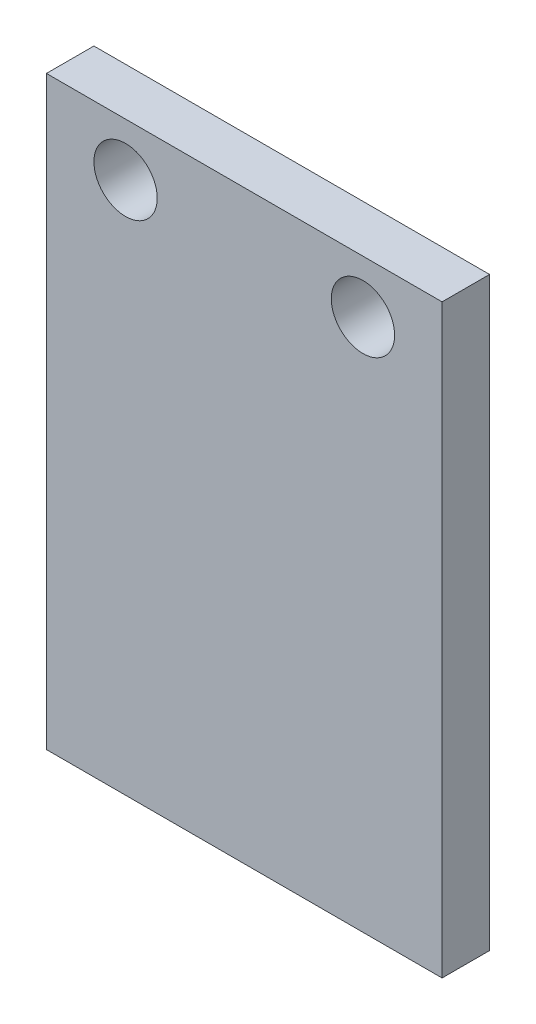
ISO-10303-21;
HEADER;
FILE_DESCRIPTION(('STEP AP214'),'2;1');
FILE_NAME('part.step','',(''),(''),'','','');
FILE_SCHEMA(('AUTOMOTIVE_DESIGN { 1 0 10303 214 1 1 1 1 }'));
ENDSEC;
DATA;
#1=APPLICATION_CONTEXT('core data for automotive mechanical design processes');
#2=APPLICATION_PROTOCOL_DEFINITION('international standard','automotive_design',2000,#1);
#3=PRODUCT_CONTEXT('',#1,'mechanical');
#4=PRODUCT('Part','Part','',(#3));
#5=PRODUCT_RELATED_PRODUCT_CATEGORY('part','',(#4));
#6=PRODUCT_DEFINITION_FORMATION('','',#4);
#7=PRODUCT_DEFINITION_CONTEXT('part definition',#1,'design');
#8=PRODUCT_DEFINITION('design','',#6,#7);
#9=PRODUCT_DEFINITION_SHAPE('','',#8);
#10=(LENGTH_UNIT() NAMED_UNIT(*) SI_UNIT(.MILLI.,.METRE.));
#11=(NAMED_UNIT(*) PLANE_ANGLE_UNIT() SI_UNIT($,.RADIAN.));
#12=(NAMED_UNIT(*) SI_UNIT($,.STERADIAN.) SOLID_ANGLE_UNIT());
#13=UNCERTAINTY_MEASURE_WITH_UNIT(LENGTH_MEASURE(1.E-05),#10,'distance_accuracy_value','');
#14=(GEOMETRIC_REPRESENTATION_CONTEXT(3) GLOBAL_UNCERTAINTY_ASSIGNED_CONTEXT((#13)) GLOBAL_UNIT_ASSIGNED_CONTEXT((#10,
#11,#12)) REPRESENTATION_CONTEXT('',''));
#15=CARTESIAN_POINT('',(0.,0.,0.));
#16=DIRECTION('',(0.,0.,1.));
#17=DIRECTION('',(1.,0.,0.));
#18=AXIS2_PLACEMENT_3D('',#15,#16,#17);
#19=CARTESIAN_POINT('',(0.,0.,1.5));
#20=DIRECTION('',(0.,0.,-1.));
#21=DIRECTION('',(-1.,0.,0.));
#22=AXIS2_PLACEMENT_3D('',#19,#20,#21);
#23=PLANE('',#22);
#24=DIRECTION('',(0.,1.,0.));
#25=VECTOR('',#24,1.);
#26=CARTESIAN_POINT('',(12.5,-18.5,1.5));
#27=LINE('',#26,#25);
#28=CARTESIAN_POINT('',(12.5,-18.5,1.5));
#29=VERTEX_POINT('',#28);
#30=CARTESIAN_POINT('',(12.5,18.5,1.5));
#31=VERTEX_POINT('',#30);
#32=EDGE_CURVE('E92',#29,#31,#27,.T.);
#33=ORIENTED_EDGE('',*,*,#32,.T.);
#34=DIRECTION('',(-1.,0.,0.));
#35=VECTOR('',#34,1.);
#36=CARTESIAN_POINT('',(-12.5,18.5,1.5));
#37=LINE('',#36,#35);
#38=CARTESIAN_POINT('',(-12.5,18.5,1.5));
#39=VERTEX_POINT('',#38);
#40=EDGE_CURVE('E87',#31,#39,#37,.T.);
#41=ORIENTED_EDGE('',*,*,#40,.T.);
#42=DIRECTION('',(0.,-1.,0.));
#43=VECTOR('',#42,1.);
#44=CARTESIAN_POINT('',(-12.5,-18.5,1.5));
#45=LINE('',#44,#43);
#46=CARTESIAN_POINT('',(-12.5,-18.5,1.5));
#47=VERTEX_POINT('',#46);
#48=EDGE_CURVE('E90',#39,#47,#45,.T.);
#49=ORIENTED_EDGE('',*,*,#48,.T.);
#50=DIRECTION('',(1.,0.,0.));
#51=VECTOR('',#50,1.);
#52=CARTESIAN_POINT('',(-12.5,-18.5,1.5));
#53=LINE('',#52,#51);
#54=EDGE_CURVE('E57',#47,#29,#53,.T.);
#55=ORIENTED_EDGE('',*,*,#54,.T.);
#56=EDGE_LOOP('',(#33,#41,#49,#55));
#57=FACE_BOUND('',#56,.T.);
#58=CARTESIAN_POINT('',(-7.5,15.17,1.5));
#59=DIRECTION('',(0.,0.,1.));
#60=DIRECTION('',(1.,0.,0.));
#61=AXIS2_PLACEMENT_3D('',#58,#59,#60);
#62=CIRCLE('',#61,2.);
#63=CARTESIAN_POINT('',(-5.5,15.17,1.5));
#64=VERTEX_POINT('',#63);
#65=EDGE_CURVE('E112',#64,#64,#62,.T.);
#66=ORIENTED_EDGE('',*,*,#65,.F.);
#67=EDGE_LOOP('',(#66));
#68=FACE_BOUND('',#67,.T.);
#69=CARTESIAN_POINT('',(7.5,15.17,1.5));
#70=DIRECTION('',(0.,0.,1.));
#71=DIRECTION('',(1.,0.,0.));
#72=AXIS2_PLACEMENT_3D('',#69,#70,#71);
#73=CIRCLE('',#72,2.);
#74=CARTESIAN_POINT('',(9.5,15.17,1.5));
#75=VERTEX_POINT('',#74);
#76=EDGE_CURVE('E134',#75,#75,#73,.T.);
#77=ORIENTED_EDGE('',*,*,#76,.F.);
#78=EDGE_LOOP('',(#77));
#79=FACE_BOUND('',#78,.T.);
#80=ADVANCED_FACE('F39',(#57,#68,#79),#23,.F.);
#81=CARTESIAN_POINT('',(0.,0.,-1.5));
#82=DIRECTION('',(0.,0.,-1.));
#83=DIRECTION('',(-1.,0.,0.));
#84=AXIS2_PLACEMENT_3D('',#81,#82,#83);
#85=PLANE('',#84);
#86=CARTESIAN_POINT('',(-7.5,15.17,-1.5));
#87=DIRECTION('',(0.,0.,1.));
#88=DIRECTION('',(1.,0.,0.));
#89=AXIS2_PLACEMENT_3D('',#86,#87,#88);
#90=CIRCLE('',#89,2.);
#91=CARTESIAN_POINT('',(-5.5,15.17,-1.5));
#92=VERTEX_POINT('',#91);
#93=EDGE_CURVE('E130',#92,#92,#90,.T.);
#94=ORIENTED_EDGE('',*,*,#93,.T.);
#95=EDGE_LOOP('',(#94));
#96=FACE_BOUND('',#95,.T.);
#97=DIRECTION('',(0.,1.,0.));
#98=VECTOR('',#97,1.);
#99=CARTESIAN_POINT('',(12.5,-18.5,-1.5));
#100=LINE('',#99,#98);
#101=CARTESIAN_POINT('',(12.5,-18.5,-1.5));
#102=VERTEX_POINT('',#101);
#103=CARTESIAN_POINT('',(12.5,18.5,-1.5));
#104=VERTEX_POINT('',#103);
#105=EDGE_CURVE('E108',#102,#104,#100,.T.);
#106=ORIENTED_EDGE('',*,*,#105,.F.);
#107=DIRECTION('',(1.,0.,0.));
#108=VECTOR('',#107,1.);
#109=CARTESIAN_POINT('',(-12.5,-18.5,-1.5));
#110=LINE('',#109,#108);
#111=CARTESIAN_POINT('',(-12.5,-18.5,-1.5));
#112=VERTEX_POINT('',#111);
#113=EDGE_CURVE('E80',#112,#102,#110,.T.);
#114=ORIENTED_EDGE('',*,*,#113,.F.);
#115=DIRECTION('',(0.,-1.,0.));
#116=VECTOR('',#115,1.);
#117=CARTESIAN_POINT('',(-12.5,-18.5,-1.5));
#118=LINE('',#117,#116);
#119=CARTESIAN_POINT('',(-12.5,18.5,-1.5));
#120=VERTEX_POINT('',#119);
#121=EDGE_CURVE('E74',#120,#112,#118,.T.);
#122=ORIENTED_EDGE('',*,*,#121,.F.);
#123=DIRECTION('',(-1.,0.,0.));
#124=VECTOR('',#123,1.);
#125=CARTESIAN_POINT('',(-12.5,18.5,-1.5));
#126=LINE('',#125,#124);
#127=EDGE_CURVE('E97',#104,#120,#126,.T.);
#128=ORIENTED_EDGE('',*,*,#127,.F.);
#129=EDGE_LOOP('',(#106,#114,#122,#128));
#130=FACE_BOUND('',#129,.T.);
#131=CARTESIAN_POINT('',(7.5,15.17,-1.5));
#132=DIRECTION('',(0.,0.,1.));
#133=DIRECTION('',(1.,0.,0.));
#134=AXIS2_PLACEMENT_3D('',#131,#132,#133);
#135=CIRCLE('',#134,2.);
#136=CARTESIAN_POINT('',(9.5,15.17,-1.5));
#137=VERTEX_POINT('',#136);
#138=EDGE_CURVE('E138',#137,#137,#135,.T.);
#139=ORIENTED_EDGE('',*,*,#138,.T.);
#140=EDGE_LOOP('',(#139));
#141=FACE_BOUND('',#140,.T.);
#142=ADVANCED_FACE('F125',(#96,#130,#141),#85,.T.);
#143=CARTESIAN_POINT('',(12.5,-18.5,1.5));
#144=DIRECTION('',(-1.,0.,0.));
#145=DIRECTION('',(0.,0.,1.));
#146=AXIS2_PLACEMENT_3D('',#143,#144,#145);
#147=PLANE('',#146);
#148=ORIENTED_EDGE('',*,*,#105,.T.);
#149=DIRECTION('',(0.,0.,-1.));
#150=VECTOR('',#149,1.);
#151=CARTESIAN_POINT('',(12.5,18.5,1.5));
#152=LINE('',#151,#150);
#153=EDGE_CURVE('E11',#31,#104,#152,.T.);
#154=ORIENTED_EDGE('',*,*,#153,.F.);
#155=ORIENTED_EDGE('',*,*,#32,.F.);
#156=DIRECTION('',(0.,0.,-1.));
#157=VECTOR('',#156,1.);
#158=CARTESIAN_POINT('',(12.5,-18.5,1.5));
#159=LINE('',#158,#157);
#160=EDGE_CURVE('E104',#29,#102,#159,.T.);
#161=ORIENTED_EDGE('',*,*,#160,.T.);
#162=EDGE_LOOP('',(#148,#154,#155,#161));
#163=FACE_BOUND('',#162,.T.);
#164=ADVANCED_FACE('F41',(#163),#147,.F.);
#165=CARTESIAN_POINT('',(-12.5,18.5,1.5));
#166=DIRECTION('',(0.,-1.,0.));
#167=DIRECTION('',(0.,0.,-1.));
#168=AXIS2_PLACEMENT_3D('',#165,#166,#167);
#169=PLANE('',#168);
#170=ORIENTED_EDGE('',*,*,#127,.T.);
#171=DIRECTION('',(0.,0.,-1.));
#172=VECTOR('',#171,1.);
#173=CARTESIAN_POINT('',(-12.5,18.5,1.5));
#174=LINE('',#173,#172);
#175=EDGE_CURVE('E49',#39,#120,#174,.T.);
#176=ORIENTED_EDGE('',*,*,#175,.F.);
#177=ORIENTED_EDGE('',*,*,#40,.F.);
#178=ORIENTED_EDGE('',*,*,#153,.T.);
#179=EDGE_LOOP('',(#170,#176,#177,#178));
#180=FACE_BOUND('',#179,.T.);
#181=ADVANCED_FACE('F96',(#180),#169,.F.);
#182=CARTESIAN_POINT('',(-12.5,-18.5,1.5));
#183=DIRECTION('',(1.,0.,0.));
#184=DIRECTION('',(0.,1.,0.));
#185=AXIS2_PLACEMENT_3D('',#182,#183,#184);
#186=PLANE('',#185);
#187=ORIENTED_EDGE('',*,*,#121,.T.);
#188=DIRECTION('',(0.,0.,-1.));
#189=VECTOR('',#188,1.);
#190=CARTESIAN_POINT('',(-12.5,-18.5,1.5));
#191=LINE('',#190,#189);
#192=EDGE_CURVE('E99',#47,#112,#191,.T.);
#193=ORIENTED_EDGE('',*,*,#192,.F.);
#194=ORIENTED_EDGE('',*,*,#48,.F.);
#195=ORIENTED_EDGE('',*,*,#175,.T.);
#196=EDGE_LOOP('',(#187,#193,#194,#195));
#197=FACE_BOUND('',#196,.T.);
#198=ADVANCED_FACE('F100',(#197),#186,.F.);
#199=CARTESIAN_POINT('',(-12.5,-18.5,1.5));
#200=DIRECTION('',(0.,1.,0.));
#201=DIRECTION('',(0.,0.,1.));
#202=AXIS2_PLACEMENT_3D('',#199,#200,#201);
#203=PLANE('',#202);
#204=ORIENTED_EDGE('',*,*,#113,.T.);
#205=ORIENTED_EDGE('',*,*,#160,.F.);
#206=ORIENTED_EDGE('',*,*,#54,.F.);
#207=ORIENTED_EDGE('',*,*,#192,.T.);
#208=EDGE_LOOP('',(#204,#205,#206,#207));
#209=FACE_BOUND('',#208,.T.);
#210=ADVANCED_FACE('F122',(#209),#203,.F.);
#211=CARTESIAN_POINT('',(-7.5,15.17,1.5));
#212=DIRECTION('',(0.,0.,-1.));
#213=DIRECTION('',(-1.,0.,0.));
#214=AXIS2_PLACEMENT_3D('',#211,#212,#213);
#215=CYLINDRICAL_SURFACE('',#214,2.);
#216=ORIENTED_EDGE('',*,*,#65,.T.);
#217=EDGE_LOOP('',(#216));
#218=FACE_BOUND('',#217,.T.);
#219=ORIENTED_EDGE('',*,*,#93,.F.);
#220=EDGE_LOOP('',(#219));
#221=FACE_BOUND('',#220,.T.);
#222=ADVANCED_FACE('F157',(#218,#221),#215,.F.);
#223=CARTESIAN_POINT('',(7.5,15.17,1.5));
#224=DIRECTION('',(0.,0.,-1.));
#225=DIRECTION('',(-1.,0.,0.));
#226=AXIS2_PLACEMENT_3D('',#223,#224,#225);
#227=CYLINDRICAL_SURFACE('',#226,2.);
#228=ORIENTED_EDGE('',*,*,#76,.T.);
#229=EDGE_LOOP('',(#228));
#230=FACE_BOUND('',#229,.T.);
#231=ORIENTED_EDGE('',*,*,#138,.F.);
#232=EDGE_LOOP('',(#231));
#233=FACE_BOUND('',#232,.T.);
#234=ADVANCED_FACE('F146',(#230,#233),#227,.F.);
#235=CLOSED_SHELL('',(#80,#142,#164,#181,#198,#210,#222,#234));
#236=MANIFOLD_SOLID_BREP('B2',#235);
#237=ADVANCED_BREP_SHAPE_REPRESENTATION('',(#18,#236),#14);
#238=SHAPE_DEFINITION_REPRESENTATION(#9,#237);
ENDSEC;
END-ISO-10303-21;
